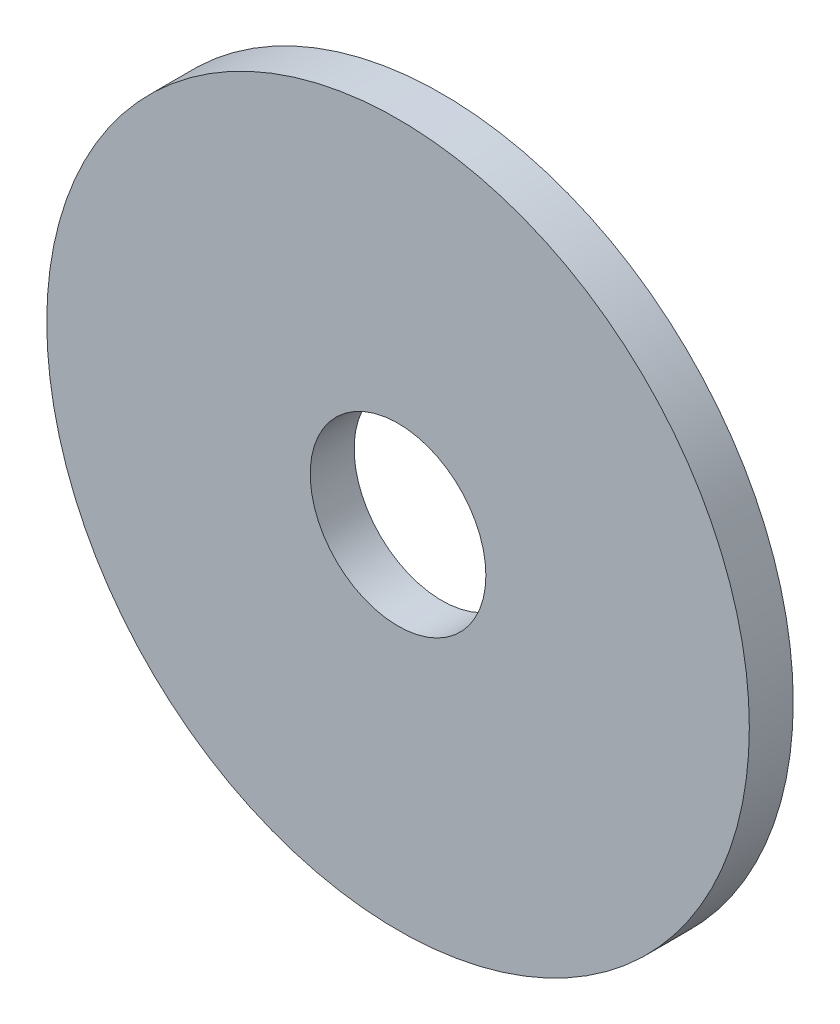
ISO-10303-21;
HEADER;
FILE_DESCRIPTION(('STEP AP214'),'2;1');
FILE_NAME('part.step','',(''),(''),'','','');
FILE_SCHEMA(('AUTOMOTIVE_DESIGN { 1 0 10303 214 1 1 1 1 }'));
ENDSEC;
DATA;
#1=APPLICATION_CONTEXT('core data for automotive mechanical design processes');
#2=APPLICATION_PROTOCOL_DEFINITION('international standard','automotive_design',2000,#1);
#3=PRODUCT_CONTEXT('',#1,'mechanical');
#4=PRODUCT('Part','Part','',(#3));
#5=PRODUCT_RELATED_PRODUCT_CATEGORY('part','',(#4));
#6=PRODUCT_DEFINITION_FORMATION('','',#4);
#7=PRODUCT_DEFINITION_CONTEXT('part definition',#1,'design');
#8=PRODUCT_DEFINITION('design','',#6,#7);
#9=PRODUCT_DEFINITION_SHAPE('','',#8);
#10=(LENGTH_UNIT() NAMED_UNIT(*) SI_UNIT(.MILLI.,.METRE.));
#11=(NAMED_UNIT(*) PLANE_ANGLE_UNIT() SI_UNIT($,.RADIAN.));
#12=(NAMED_UNIT(*) SI_UNIT($,.STERADIAN.) SOLID_ANGLE_UNIT());
#13=UNCERTAINTY_MEASURE_WITH_UNIT(LENGTH_MEASURE(1.E-05),#10,'distance_accuracy_value','');
#14=(GEOMETRIC_REPRESENTATION_CONTEXT(3) GLOBAL_UNCERTAINTY_ASSIGNED_CONTEXT((#13)) GLOBAL_UNIT_ASSIGNED_CONTEXT((#10,
#11,#12)) REPRESENTATION_CONTEXT('',''));
#15=CARTESIAN_POINT('',(0.,0.,0.));
#16=DIRECTION('',(0.,0.,1.));
#17=DIRECTION('',(1.,0.,0.));
#18=AXIS2_PLACEMENT_3D('',#15,#16,#17);
#19=CARTESIAN_POINT('',(-196.682719320137,-420.602297752566,-806.485786522958));
#20=DIRECTION('',(0.,0.,-1.));
#21=DIRECTION('',(-1.,0.,0.));
#22=AXIS2_PLACEMENT_3D('',#19,#20,#21);
#23=PLANE('',#22);
#24=CARTESIAN_POINT('',(-196.682719320137,-420.602297752566,-806.485786522958));
#25=DIRECTION('',(0.,0.,1.));
#26=DIRECTION('',(1.,0.,0.));
#27=AXIS2_PLACEMENT_3D('',#24,#25,#26);
#28=CIRCLE('',#27,20.);
#29=CARTESIAN_POINT('',(-176.682719320137,-420.602297752566,-806.485786522958));
#30=VERTEX_POINT('',#29);
#31=EDGE_CURVE('E27',#30,#30,#28,.T.);
#32=ORIENTED_EDGE('',*,*,#31,.T.);
#33=EDGE_LOOP('',(#32));
#34=FACE_BOUND('',#33,.T.);
#35=CARTESIAN_POINT('',(-196.682719320137,-420.602297752566,-806.485786522958));
#36=DIRECTION('',(0.,0.,1.));
#37=DIRECTION('',(1.,0.,0.));
#38=AXIS2_PLACEMENT_3D('',#35,#36,#37);
#39=CIRCLE('',#38,80.);
#40=CARTESIAN_POINT('',(-116.682719320137,-420.602297752566,-806.485786522958));
#41=VERTEX_POINT('',#40);
#42=EDGE_CURVE('E18',#41,#41,#39,.T.);
#43=ORIENTED_EDGE('',*,*,#42,.F.);
#44=EDGE_LOOP('',(#43));
#45=FACE_BOUND('',#44,.T.);
#46=ADVANCED_FACE('F15',(#34,#45),#23,.T.);
#47=CARTESIAN_POINT('',(-196.682719320137,-420.602297752566,-801.48578652296));
#48=DIRECTION('',(0.,0.,1.));
#49=DIRECTION('',(1.,0.,0.));
#50=AXIS2_PLACEMENT_3D('',#47,#48,#49);
#51=CYLINDRICAL_SURFACE('',#50,80.);
#52=CARTESIAN_POINT('',(-196.682719320137,-420.602297752566,-796.48578652296));
#53=DIRECTION('',(0.,0.,1.));
#54=DIRECTION('',(1.,0.,0.));
#55=AXIS2_PLACEMENT_3D('',#52,#53,#54);
#56=CIRCLE('',#55,80.);
#57=CARTESIAN_POINT('',(-116.682719320137,-420.602297752566,-796.48578652296));
#58=VERTEX_POINT('',#57);
#59=EDGE_CURVE('E22',#58,#58,#56,.T.);
#60=ORIENTED_EDGE('',*,*,#59,.F.);
#61=EDGE_LOOP('',(#60));
#62=FACE_BOUND('',#61,.T.);
#63=ORIENTED_EDGE('',*,*,#42,.T.);
#64=EDGE_LOOP('',(#63));
#65=FACE_BOUND('',#64,.T.);
#66=ADVANCED_FACE('F35',(#62,#65),#51,.T.);
#67=CARTESIAN_POINT('',(-196.682719320137,-420.602297752566,-801.48578652296));
#68=DIRECTION('',(0.,0.,1.));
#69=DIRECTION('',(1.,0.,0.));
#70=AXIS2_PLACEMENT_3D('',#67,#68,#69);
#71=CYLINDRICAL_SURFACE('',#70,20.);
#72=CARTESIAN_POINT('',(-196.682719320137,-420.602297752566,-796.48578652296));
#73=DIRECTION('',(0.,0.,1.));
#74=DIRECTION('',(1.,0.,0.));
#75=AXIS2_PLACEMENT_3D('',#72,#73,#74);
#76=CIRCLE('',#75,20.);
#77=CARTESIAN_POINT('',(-176.682719320137,-420.602297752566,-796.48578652296));
#78=VERTEX_POINT('',#77);
#79=EDGE_CURVE('E10',#78,#78,#76,.F.);
#80=ORIENTED_EDGE('',*,*,#79,.F.);
#81=EDGE_LOOP('',(#80));
#82=FACE_BOUND('',#81,.T.);
#83=ORIENTED_EDGE('',*,*,#31,.F.);
#84=EDGE_LOOP('',(#83));
#85=FACE_BOUND('',#84,.T.);
#86=ADVANCED_FACE('F42',(#82,#85),#71,.F.);
#87=CARTESIAN_POINT('',(-196.682719320137,-420.602297752566,-796.48578652296));
#88=DIRECTION('',(0.,0.,1.));
#89=DIRECTION('',(1.,0.,0.));
#90=AXIS2_PLACEMENT_3D('',#87,#88,#89);
#91=PLANE('',#90);
#92=ORIENTED_EDGE('',*,*,#79,.T.);
#93=EDGE_LOOP('',(#92));
#94=FACE_BOUND('',#93,.T.);
#95=ORIENTED_EDGE('',*,*,#59,.T.);
#96=EDGE_LOOP('',(#95));
#97=FACE_BOUND('',#96,.T.);
#98=ADVANCED_FACE('F44',(#94,#97),#91,.T.);
#99=CLOSED_SHELL('',(#46,#66,#86,#98));
#100=MANIFOLD_SOLID_BREP('B1',#99);
#101=ADVANCED_BREP_SHAPE_REPRESENTATION('',(#18,#100),#14);
#102=SHAPE_DEFINITION_REPRESENTATION(#9,#101);
ENDSEC;
END-ISO-10303-21;
